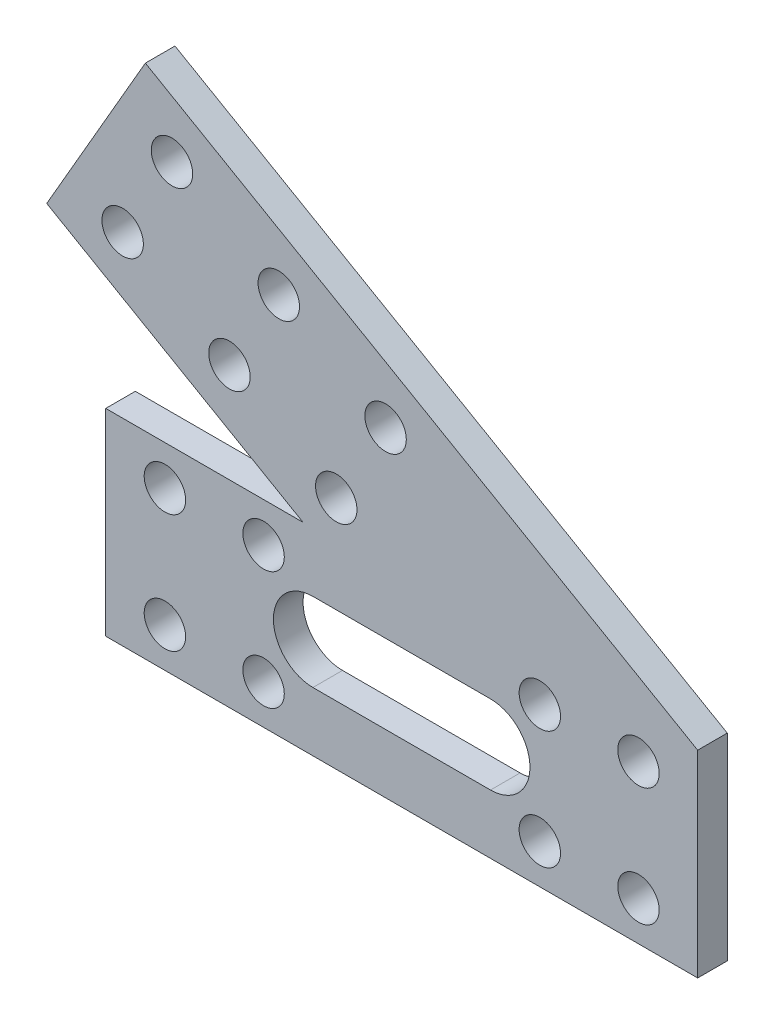
ISO-10303-21;
HEADER;
FILE_DESCRIPTION(('STEP AP214'),'2;1');
FILE_NAME('part.step','',(''),(''),'','','');
FILE_SCHEMA(('AUTOMOTIVE_DESIGN { 1 0 10303 214 1 1 1 1 }'));
ENDSEC;
DATA;
#1=APPLICATION_CONTEXT('core data for automotive mechanical design processes');
#2=APPLICATION_PROTOCOL_DEFINITION('international standard','automotive_design',2000,#1);
#3=PRODUCT_CONTEXT('',#1,'mechanical');
#4=PRODUCT('Part','Part','',(#3));
#5=PRODUCT_RELATED_PRODUCT_CATEGORY('part','',(#4));
#6=PRODUCT_DEFINITION_FORMATION('','',#4);
#7=PRODUCT_DEFINITION_CONTEXT('part definition',#1,'design');
#8=PRODUCT_DEFINITION('design','',#6,#7);
#9=PRODUCT_DEFINITION_SHAPE('','',#8);
#10=(LENGTH_UNIT() NAMED_UNIT(*) SI_UNIT(.MILLI.,.METRE.));
#11=(NAMED_UNIT(*) PLANE_ANGLE_UNIT() SI_UNIT($,.RADIAN.));
#12=(NAMED_UNIT(*) SI_UNIT($,.STERADIAN.) SOLID_ANGLE_UNIT());
#13=UNCERTAINTY_MEASURE_WITH_UNIT(LENGTH_MEASURE(1.E-05),#10,'distance_accuracy_value','');
#14=(GEOMETRIC_REPRESENTATION_CONTEXT(3) GLOBAL_UNCERTAINTY_ASSIGNED_CONTEXT((#13)) GLOBAL_UNIT_ASSIGNED_CONTEXT((#10,
#11,#12)) REPRESENTATION_CONTEXT('',''));
#15=CARTESIAN_POINT('',(0.,0.,0.));
#16=DIRECTION('',(0.,0.,1.));
#17=DIRECTION('',(1.,0.,0.));
#18=AXIS2_PLACEMENT_3D('',#15,#16,#17);
#19=CARTESIAN_POINT('',(60.,20.,3.));
#20=DIRECTION('',(-1.,0.,0.));
#21=DIRECTION('',(0.,0.,1.));
#22=AXIS2_PLACEMENT_3D('',#19,#20,#21);
#23=PLANE('',#22);
#24=DIRECTION('',(0.,1.,0.));
#25=VECTOR('',#24,1.);
#26=CARTESIAN_POINT('',(60.,20.,0.));
#27=LINE('',#26,#25);
#28=CARTESIAN_POINT('',(60.,0.,0.));
#29=VERTEX_POINT('',#28);
#30=CARTESIAN_POINT('',(60.,20.,0.));
#31=VERTEX_POINT('',#30);
#32=EDGE_CURVE('E203',#29,#31,#27,.T.);
#33=ORIENTED_EDGE('',*,*,#32,.T.);
#34=DIRECTION('',(0.,0.,-1.));
#35=VECTOR('',#34,1.);
#36=CARTESIAN_POINT('',(60.,20.,3.));
#37=LINE('',#36,#35);
#38=CARTESIAN_POINT('',(60.,20.,3.));
#39=VERTEX_POINT('',#38);
#40=EDGE_CURVE('E234',#39,#31,#37,.T.);
#41=ORIENTED_EDGE('',*,*,#40,.F.);
#42=DIRECTION('',(0.,1.,0.));
#43=VECTOR('',#42,1.);
#44=CARTESIAN_POINT('',(60.,20.,3.));
#45=LINE('',#44,#43);
#46=CARTESIAN_POINT('',(60.,0.,3.));
#47=VERTEX_POINT('',#46);
#48=EDGE_CURVE('E186',#47,#39,#45,.T.);
#49=ORIENTED_EDGE('',*,*,#48,.F.);
#50=DIRECTION('',(0.,0.,-1.));
#51=VECTOR('',#50,1.);
#52=CARTESIAN_POINT('',(60.,0.,3.));
#53=LINE('',#52,#51);
#54=EDGE_CURVE('E202',#47,#29,#53,.T.);
#55=ORIENTED_EDGE('',*,*,#54,.T.);
#56=EDGE_LOOP('',(#33,#41,#49,#55));
#57=FACE_BOUND('',#56,.T.);
#58=ADVANCED_FACE('F35',(#57),#23,.F.);
#59=CARTESIAN_POINT('',(4.01923788646753,52.3205080756886,3.));
#60=DIRECTION('',(-0.500000000000002,-0.866025403784437,0.));
#61=DIRECTION('',(0.866025403784437,-0.500000000000002,0.));
#62=AXIS2_PLACEMENT_3D('',#59,#60,#61);
#63=PLANE('',#62);
#64=DIRECTION('',(-0.866025403784437,0.500000000000002,0.));
#65=VECTOR('',#64,1.);
#66=CARTESIAN_POINT('',(4.01923788646753,52.3205080756886,0.));
#67=LINE('',#66,#65);
#68=CARTESIAN_POINT('',(4.01923788646753,52.3205080756886,0.));
#69=VERTEX_POINT('',#68);
#70=EDGE_CURVE('E206',#31,#69,#67,.T.);
#71=ORIENTED_EDGE('',*,*,#70,.T.);
#72=DIRECTION('',(0.,0.,-1.));
#73=VECTOR('',#72,1.);
#74=CARTESIAN_POINT('',(4.01923788646753,52.3205080756886,3.));
#75=LINE('',#74,#73);
#76=CARTESIAN_POINT('',(4.01923788646753,52.3205080756886,3.));
#77=VERTEX_POINT('',#76);
#78=EDGE_CURVE('E231',#77,#69,#75,.T.);
#79=ORIENTED_EDGE('',*,*,#78,.F.);
#80=DIRECTION('',(-0.866025403784437,0.500000000000002,0.));
#81=VECTOR('',#80,1.);
#82=CARTESIAN_POINT('',(4.01923788646753,52.3205080756886,3.));
#83=LINE('',#82,#81);
#84=EDGE_CURVE('E189',#39,#77,#83,.T.);
#85=ORIENTED_EDGE('',*,*,#84,.F.);
#86=ORIENTED_EDGE('',*,*,#40,.T.);
#87=EDGE_LOOP('',(#71,#79,#85,#86));
#88=FACE_BOUND('',#87,.T.);
#89=ADVANCED_FACE('F350',(#88),#63,.F.);
#90=CARTESIAN_POINT('',(-5.98076211353237,34.9999999999998,3.));
#91=DIRECTION('',(0.866025403784441,-0.499999999999995,0.));
#92=DIRECTION('',(0.499999999999995,0.866025403784441,0.));
#93=AXIS2_PLACEMENT_3D('',#90,#91,#92);
#94=PLANE('',#93);
#95=DIRECTION('',(-0.499999999999995,-0.866025403784441,0.));
#96=VECTOR('',#95,1.);
#97=CARTESIAN_POINT('',(-5.98076211353237,34.9999999999998,0.));
#98=LINE('',#97,#96);
#99=CARTESIAN_POINT('',(-5.98076211353237,34.9999999999998,0.));
#100=VERTEX_POINT('',#99);
#101=EDGE_CURVE('E208',#69,#100,#98,.T.);
#102=ORIENTED_EDGE('',*,*,#101,.T.);
#103=DIRECTION('',(0.,0.,-1.));
#104=VECTOR('',#103,1.);
#105=CARTESIAN_POINT('',(-5.98076211353237,34.9999999999998,3.));
#106=LINE('',#105,#104);
#107=CARTESIAN_POINT('',(-5.98076211353237,34.9999999999998,3.));
#108=VERTEX_POINT('',#107);
#109=EDGE_CURVE('E228',#108,#100,#106,.T.);
#110=ORIENTED_EDGE('',*,*,#109,.F.);
#111=DIRECTION('',(-0.499999999999995,-0.866025403784441,0.));
#112=VECTOR('',#111,1.);
#113=CARTESIAN_POINT('',(-5.98076211353237,34.9999999999998,3.));
#114=LINE('',#113,#112);
#115=EDGE_CURVE('E192',#77,#108,#114,.T.);
#116=ORIENTED_EDGE('',*,*,#115,.F.);
#117=ORIENTED_EDGE('',*,*,#78,.T.);
#118=EDGE_LOOP('',(#102,#110,#116,#117));
#119=FACE_BOUND('',#118,.T.);
#120=ADVANCED_FACE('F347',(#119),#94,.F.);
#121=CARTESIAN_POINT('',(20.0000000000009,19.9999999999999,3.));
#122=DIRECTION('',(0.499999999999995,0.866025403784442,0.));
#123=DIRECTION('',(-0.866025403784442,0.499999999999995,0.));
#124=AXIS2_PLACEMENT_3D('',#121,#122,#123);
#125=PLANE('',#124);
#126=DIRECTION('',(0.866025403784441,-0.499999999999995,0.));
#127=VECTOR('',#126,1.);
#128=CARTESIAN_POINT('',(20.0000000000009,19.9999999999999,0.));
#129=LINE('',#128,#127);
#130=CARTESIAN_POINT('',(20.0000000000009,19.9999999999999,0.));
#131=VERTEX_POINT('',#130);
#132=EDGE_CURVE('E210',#100,#131,#129,.T.);
#133=ORIENTED_EDGE('',*,*,#132,.T.);
#134=DIRECTION('',(0.,0.,-1.));
#135=VECTOR('',#134,1.);
#136=CARTESIAN_POINT('',(20.0000000000009,19.9999999999999,3.));
#137=LINE('',#136,#135);
#138=CARTESIAN_POINT('',(20.0000000000009,19.9999999999999,3.));
#139=VERTEX_POINT('',#138);
#140=EDGE_CURVE('E225',#139,#131,#137,.T.);
#141=ORIENTED_EDGE('',*,*,#140,.F.);
#142=DIRECTION('',(0.866025403784441,-0.499999999999995,0.));
#143=VECTOR('',#142,1.);
#144=CARTESIAN_POINT('',(20.0000000000009,19.9999999999999,3.));
#145=LINE('',#144,#143);
#146=EDGE_CURVE('E194',#108,#139,#145,.T.);
#147=ORIENTED_EDGE('',*,*,#146,.F.);
#148=ORIENTED_EDGE('',*,*,#109,.T.);
#149=EDGE_LOOP('',(#133,#141,#147,#148));
#150=FACE_BOUND('',#149,.T.);
#151=ADVANCED_FACE('F343',(#150),#125,.F.);
#152=CARTESIAN_POINT('',(20.0000000000009,19.9999999999999,3.));
#153=DIRECTION('',(0.,-1.,0.));
#154=DIRECTION('',(1.,0.,0.));
#155=AXIS2_PLACEMENT_3D('',#152,#153,#154);
#156=PLANE('',#155);
#157=DIRECTION('',(-1.,0.,0.));
#158=VECTOR('',#157,1.);
#159=CARTESIAN_POINT('',(20.0000000000009,19.9999999999999,0.));
#160=LINE('',#159,#158);
#161=CARTESIAN_POINT('',(0.,20.,0.));
#162=VERTEX_POINT('',#161);
#163=EDGE_CURVE('E212',#131,#162,#160,.T.);
#164=ORIENTED_EDGE('',*,*,#163,.T.);
#165=DIRECTION('',(0.,0.,-1.));
#166=VECTOR('',#165,1.);
#167=CARTESIAN_POINT('',(0.,20.,3.));
#168=LINE('',#167,#166);
#169=CARTESIAN_POINT('',(0.,20.,3.));
#170=VERTEX_POINT('',#169);
#171=EDGE_CURVE('E222',#170,#162,#168,.T.);
#172=ORIENTED_EDGE('',*,*,#171,.F.);
#173=DIRECTION('',(-1.,0.,0.));
#174=VECTOR('',#173,1.);
#175=CARTESIAN_POINT('',(20.0000000000009,19.9999999999999,3.));
#176=LINE('',#175,#174);
#177=EDGE_CURVE('E196',#139,#170,#176,.T.);
#178=ORIENTED_EDGE('',*,*,#177,.F.);
#179=ORIENTED_EDGE('',*,*,#140,.T.);
#180=EDGE_LOOP('',(#164,#172,#178,#179));
#181=FACE_BOUND('',#180,.T.);
#182=ADVANCED_FACE('F338',(#181),#156,.F.);
#183=CARTESIAN_POINT('',(0.,0.,3.));
#184=DIRECTION('',(1.,0.,0.));
#185=DIRECTION('',(0.,0.,-1.));
#186=AXIS2_PLACEMENT_3D('',#183,#184,#185);
#187=PLANE('',#186);
#188=DIRECTION('',(0.,-1.,0.));
#189=VECTOR('',#188,1.);
#190=CARTESIAN_POINT('',(0.,0.,0.));
#191=LINE('',#190,#189);
#192=CARTESIAN_POINT('',(0.,0.,0.));
#193=VERTEX_POINT('',#192);
#194=EDGE_CURVE('E214',#162,#193,#191,.T.);
#195=ORIENTED_EDGE('',*,*,#194,.T.);
#196=DIRECTION('',(0.,0.,-1.));
#197=VECTOR('',#196,1.);
#198=CARTESIAN_POINT('',(0.,0.,3.));
#199=LINE('',#198,#197);
#200=CARTESIAN_POINT('',(0.,0.,3.));
#201=VERTEX_POINT('',#200);
#202=EDGE_CURVE('E219',#201,#193,#199,.T.);
#203=ORIENTED_EDGE('',*,*,#202,.F.);
#204=DIRECTION('',(0.,-1.,0.));
#205=VECTOR('',#204,1.);
#206=CARTESIAN_POINT('',(0.,0.,3.));
#207=LINE('',#206,#205);
#208=EDGE_CURVE('E198',#170,#201,#207,.T.);
#209=ORIENTED_EDGE('',*,*,#208,.F.);
#210=ORIENTED_EDGE('',*,*,#171,.T.);
#211=EDGE_LOOP('',(#195,#203,#209,#210));
#212=FACE_BOUND('',#211,.T.);
#213=ADVANCED_FACE('F333',(#212),#187,.F.);
#214=CARTESIAN_POINT('',(60.,0.,3.));
#215=DIRECTION('',(0.,1.,0.));
#216=DIRECTION('',(-1.,0.,0.));
#217=AXIS2_PLACEMENT_3D('',#214,#215,#216);
#218=PLANE('',#217);
#219=DIRECTION('',(1.,0.,0.));
#220=VECTOR('',#219,1.);
#221=CARTESIAN_POINT('',(60.,0.,0.));
#222=LINE('',#221,#220);
#223=EDGE_CURVE('E190',#193,#29,#222,.T.);
#224=ORIENTED_EDGE('',*,*,#223,.T.);
#225=ORIENTED_EDGE('',*,*,#54,.F.);
#226=DIRECTION('',(1.,0.,0.));
#227=VECTOR('',#226,1.);
#228=CARTESIAN_POINT('',(60.,0.,3.));
#229=LINE('',#228,#227);
#230=EDGE_CURVE('E200',#201,#47,#229,.T.);
#231=ORIENTED_EDGE('',*,*,#230,.F.);
#232=ORIENTED_EDGE('',*,*,#202,.T.);
#233=EDGE_LOOP('',(#224,#225,#231,#232));
#234=FACE_BOUND('',#233,.T.);
#235=ADVANCED_FACE('F329',(#234),#218,.F.);
#236=CARTESIAN_POINT('',(0.,0.,3.));
#237=DIRECTION('',(0.,0.,-1.));
#238=DIRECTION('',(-1.,0.,0.));
#239=AXIS2_PLACEMENT_3D('',#236,#237,#238);
#240=PLANE('',#239);
#241=CARTESIAN_POINT('',(6.71539030917408,44.9903810567662,3.));
#242=DIRECTION('',(0.,0.,1.));
#243=DIRECTION('',(1.,0.,0.));
#244=AXIS2_PLACEMENT_3D('',#241,#242,#243);
#245=CIRCLE('',#244,2.1);
#246=CARTESIAN_POINT('',(8.81539030917407,44.9903810567662,3.));
#247=VERTEX_POINT('',#246);
#248=EDGE_CURVE('E177',#247,#247,#245,.T.);
#249=ORIENTED_EDGE('',*,*,#248,.F.);
#250=EDGE_LOOP('',(#249));
#251=FACE_BOUND('',#250,.T.);
#252=CARTESIAN_POINT('',(44.,15.9999999999999,3.));
#253=DIRECTION('',(0.,0.,1.));
#254=DIRECTION('',(1.,0.,0.));
#255=AXIS2_PLACEMENT_3D('',#252,#253,#254);
#256=CIRCLE('',#255,2.1);
#257=CARTESIAN_POINT('',(46.1,15.9999999999999,3.));
#258=VERTEX_POINT('',#257);
#259=EDGE_CURVE('E149',#258,#258,#256,.T.);
#260=ORIENTED_EDGE('',*,*,#259,.F.);
#261=EDGE_LOOP('',(#260));
#262=FACE_BOUND('',#261,.T.);
#263=CARTESIAN_POINT('',(16.,3.99999999999991,3.));
#264=DIRECTION('',(0.,0.,1.));
#265=DIRECTION('',(1.,0.,0.));
#266=AXIS2_PLACEMENT_3D('',#263,#264,#265);
#267=CIRCLE('',#266,2.1);
#268=CARTESIAN_POINT('',(18.1,3.99999999999991,3.));
#269=VERTEX_POINT('',#268);
#270=EDGE_CURVE('E150',#269,#269,#267,.T.);
#271=ORIENTED_EDGE('',*,*,#270,.F.);
#272=EDGE_LOOP('',(#271));
#273=FACE_BOUND('',#272,.T.);
#274=CARTESIAN_POINT('',(16.,15.9999999999999,3.));
#275=DIRECTION('',(0.,0.,1.));
#276=DIRECTION('',(1.,0.,0.));
#277=AXIS2_PLACEMENT_3D('',#274,#275,#276);
#278=CIRCLE('',#277,2.1);
#279=CARTESIAN_POINT('',(18.1,15.9999999999999,3.));
#280=VERTEX_POINT('',#279);
#281=EDGE_CURVE('E153',#280,#280,#278,.T.);
#282=ORIENTED_EDGE('',*,*,#281,.F.);
#283=EDGE_LOOP('',(#282));
#284=FACE_BOUND('',#283,.T.);
#285=CARTESIAN_POINT('',(54.,3.99999999999991,3.));
#286=DIRECTION('',(0.,0.,1.));
#287=DIRECTION('',(1.,0.,0.));
#288=AXIS2_PLACEMENT_3D('',#285,#286,#287);
#289=CIRCLE('',#288,2.1);
#290=CARTESIAN_POINT('',(56.1,3.99999999999991,3.));
#291=VERTEX_POINT('',#290);
#292=EDGE_CURVE('E156',#291,#291,#289,.T.);
#293=ORIENTED_EDGE('',*,*,#292,.F.);
#294=EDGE_LOOP('',(#293));
#295=FACE_BOUND('',#294,.T.);
#296=DIRECTION('',(1.,0.,0.));
#297=VECTOR('',#296,1.);
#298=CARTESIAN_POINT('',(21.,5.99999999999991,3.));
#299=LINE('',#298,#297);
#300=CARTESIAN_POINT('',(21.,5.99999999999991,3.));
#301=VERTEX_POINT('',#300);
#302=CARTESIAN_POINT('',(39.,5.99999999999991,3.));
#303=VERTEX_POINT('',#302);
#304=EDGE_CURVE('E130',#301,#303,#299,.T.);
#305=ORIENTED_EDGE('',*,*,#304,.F.);
#306=CARTESIAN_POINT('',(21.,9.99999999999991,3.));
#307=DIRECTION('',(0.,0.,1.));
#308=DIRECTION('',(1.,0.,0.));
#309=AXIS2_PLACEMENT_3D('',#306,#307,#308);
#310=CIRCLE('',#309,4.);
#311=CARTESIAN_POINT('',(21.,13.9999999999999,3.));
#312=VERTEX_POINT('',#311);
#313=EDGE_CURVE('E51',#312,#301,#310,.T.);
#314=ORIENTED_EDGE('',*,*,#313,.F.);
#315=DIRECTION('',(-1.,0.,0.));
#316=VECTOR('',#315,1.);
#317=CARTESIAN_POINT('',(21.,13.9999999999999,3.));
#318=LINE('',#317,#316);
#319=CARTESIAN_POINT('',(39.,13.9999999999999,3.));
#320=VERTEX_POINT('',#319);
#321=EDGE_CURVE('E137',#320,#312,#318,.T.);
#322=ORIENTED_EDGE('',*,*,#321,.F.);
#323=CARTESIAN_POINT('',(39.,9.99999999999991,3.));
#324=DIRECTION('',(0.,0.,1.));
#325=DIRECTION('',(1.,0.,0.));
#326=AXIS2_PLACEMENT_3D('',#323,#324,#325);
#327=CIRCLE('',#326,4.);
#328=EDGE_CURVE('E121',#303,#320,#327,.T.);
#329=ORIENTED_EDGE('',*,*,#328,.F.);
#330=EDGE_LOOP('',(#305,#314,#322,#329));
#331=FACE_BOUND('',#330,.T.);
#332=CARTESIAN_POINT('',(44.,3.99999999999991,3.));
#333=DIRECTION('',(0.,0.,1.));
#334=DIRECTION('',(1.,0.,0.));
#335=AXIS2_PLACEMENT_3D('',#332,#333,#334);
#336=CIRCLE('',#335,2.1);
#337=CARTESIAN_POINT('',(46.1,3.99999999999991,3.));
#338=VERTEX_POINT('',#337);
#339=EDGE_CURVE('E144',#338,#338,#336,.T.);
#340=ORIENTED_EDGE('',*,*,#339,.F.);
#341=EDGE_LOOP('',(#340));
#342=FACE_BOUND('',#341,.T.);
#343=CARTESIAN_POINT('',(1.71539030917408,36.3301270189219,3.));
#344=DIRECTION('',(0.,0.,1.));
#345=DIRECTION('',(1.,0.,0.));
#346=AXIS2_PLACEMENT_3D('',#343,#344,#345);
#347=CIRCLE('',#346,2.1);
#348=CARTESIAN_POINT('',(3.81539030917407,36.3301270189219,3.));
#349=VERTEX_POINT('',#348);
#350=EDGE_CURVE('E174',#349,#349,#347,.T.);
#351=ORIENTED_EDGE('',*,*,#350,.F.);
#352=EDGE_LOOP('',(#351));
#353=FACE_BOUND('',#352,.T.);
#354=CARTESIAN_POINT('',(17.5407078564796,38.7403810567662,3.));
#355=DIRECTION('',(0.,0.,1.));
#356=DIRECTION('',(1.,0.,0.));
#357=AXIS2_PLACEMENT_3D('',#354,#355,#356);
#358=CIRCLE('',#357,2.1);
#359=CARTESIAN_POINT('',(19.6407078564796,38.7403810567662,3.));
#360=VERTEX_POINT('',#359);
#361=EDGE_CURVE('E178',#360,#360,#358,.T.);
#362=ORIENTED_EDGE('',*,*,#361,.F.);
#363=EDGE_LOOP('',(#362));
#364=FACE_BOUND('',#363,.T.);
#365=CARTESIAN_POINT('',(12.5407078564796,30.0801270189219,3.));
#366=DIRECTION('',(0.,0.,1.));
#367=DIRECTION('',(1.,0.,0.));
#368=AXIS2_PLACEMENT_3D('',#365,#366,#367);
#369=CIRCLE('',#368,2.09999999999999);
#370=CARTESIAN_POINT('',(14.6407078564796,30.0801270189219,3.));
#371=VERTEX_POINT('',#370);
#372=EDGE_CURVE('E181',#371,#371,#369,.T.);
#373=ORIENTED_EDGE('',*,*,#372,.F.);
#374=EDGE_LOOP('',(#373));
#375=FACE_BOUND('',#374,.T.);
#376=CARTESIAN_POINT('',(23.366025403785,23.8301270189219,3.));
#377=DIRECTION('',(0.,0.,1.));
#378=DIRECTION('',(1.,0.,0.));
#379=AXIS2_PLACEMENT_3D('',#376,#377,#378);
#380=CIRCLE('',#379,2.1);
#381=CARTESIAN_POINT('',(25.466025403785,23.8301270189219,3.));
#382=VERTEX_POINT('',#381);
#383=EDGE_CURVE('E171',#382,#382,#380,.T.);
#384=ORIENTED_EDGE('',*,*,#383,.F.);
#385=EDGE_LOOP('',(#384));
#386=FACE_BOUND('',#385,.T.);
#387=CARTESIAN_POINT('',(54.,15.9999999999999,3.));
#388=DIRECTION('',(0.,0.,1.));
#389=DIRECTION('',(1.,0.,0.));
#390=AXIS2_PLACEMENT_3D('',#387,#388,#389);
#391=CIRCLE('',#390,2.1);
#392=CARTESIAN_POINT('',(56.1,15.9999999999999,3.));
#393=VERTEX_POINT('',#392);
#394=EDGE_CURVE('E159',#393,#393,#391,.T.);
#395=ORIENTED_EDGE('',*,*,#394,.F.);
#396=EDGE_LOOP('',(#395));
#397=FACE_BOUND('',#396,.T.);
#398=CARTESIAN_POINT('',(6.,3.99999999999991,3.));
#399=DIRECTION('',(0.,0.,1.));
#400=DIRECTION('',(1.,0.,0.));
#401=AXIS2_PLACEMENT_3D('',#398,#399,#400);
#402=CIRCLE('',#401,2.1);
#403=CARTESIAN_POINT('',(8.1,3.99999999999991,3.));
#404=VERTEX_POINT('',#403);
#405=EDGE_CURVE('E162',#404,#404,#402,.T.);
#406=ORIENTED_EDGE('',*,*,#405,.F.);
#407=EDGE_LOOP('',(#406));
#408=FACE_BOUND('',#407,.T.);
#409=CARTESIAN_POINT('',(6.,15.9999999999999,3.));
#410=DIRECTION('',(0.,0.,1.));
#411=DIRECTION('',(1.,0.,0.));
#412=AXIS2_PLACEMENT_3D('',#409,#410,#411);
#413=CIRCLE('',#412,2.1);
#414=CARTESIAN_POINT('',(8.1,15.9999999999999,3.));
#415=VERTEX_POINT('',#414);
#416=EDGE_CURVE('E165',#415,#415,#413,.T.);
#417=ORIENTED_EDGE('',*,*,#416,.F.);
#418=EDGE_LOOP('',(#417));
#419=FACE_BOUND('',#418,.T.);
#420=CARTESIAN_POINT('',(28.366025403785,32.4903810567663,3.));
#421=DIRECTION('',(0.,0.,1.));
#422=DIRECTION('',(1.,0.,0.));
#423=AXIS2_PLACEMENT_3D('',#420,#421,#422);
#424=CIRCLE('',#423,2.1);
#425=CARTESIAN_POINT('',(30.466025403785,32.4903810567663,3.));
#426=VERTEX_POINT('',#425);
#427=EDGE_CURVE('E168',#426,#426,#424,.T.);
#428=ORIENTED_EDGE('',*,*,#427,.F.);
#429=EDGE_LOOP('',(#428));
#430=FACE_BOUND('',#429,.T.);
#431=ORIENTED_EDGE('',*,*,#48,.T.);
#432=ORIENTED_EDGE('',*,*,#84,.T.);
#433=ORIENTED_EDGE('',*,*,#115,.T.);
#434=ORIENTED_EDGE('',*,*,#146,.T.);
#435=ORIENTED_EDGE('',*,*,#177,.T.);
#436=ORIENTED_EDGE('',*,*,#208,.T.);
#437=ORIENTED_EDGE('',*,*,#230,.T.);
#438=EDGE_LOOP('',(#431,#432,#433,#434,#435,#436,#437));
#439=FACE_BOUND('',#438,.T.);
#440=ADVANCED_FACE('F134',(#251,#262,#273,#284,#295,#331,#342,#353,#364,#375,#386,#397,#408,
#419,#430,#439),#240,.F.);
#441=CARTESIAN_POINT('',(0.,0.,0.));
#442=DIRECTION('',(0.,0.,-1.));
#443=DIRECTION('',(-1.,0.,0.));
#444=AXIS2_PLACEMENT_3D('',#441,#442,#443);
#445=PLANE('',#444);
#446=CARTESIAN_POINT('',(6.71539030917408,44.9903810567662,0.));
#447=DIRECTION('',(0.,0.,-1.));
#448=DIRECTION('',(-1.,0.,0.));
#449=AXIS2_PLACEMENT_3D('',#446,#447,#448);
#450=CIRCLE('',#449,2.1);
#451=CARTESIAN_POINT('',(4.61539030917408,44.9903810567662,0.));
#452=VERTEX_POINT('',#451);
#453=EDGE_CURVE('E38',#452,#452,#450,.T.);
#454=ORIENTED_EDGE('',*,*,#453,.F.);
#455=EDGE_LOOP('',(#454));
#456=FACE_BOUND('',#455,.T.);
#457=CARTESIAN_POINT('',(44.,15.9999999999999,0.));
#458=DIRECTION('',(0.,0.,-1.));
#459=DIRECTION('',(-1.,0.,0.));
#460=AXIS2_PLACEMENT_3D('',#457,#458,#459);
#461=CIRCLE('',#460,2.1);
#462=CARTESIAN_POINT('',(41.9,15.9999999999999,0.));
#463=VERTEX_POINT('',#462);
#464=EDGE_CURVE('E276',#463,#463,#461,.T.);
#465=ORIENTED_EDGE('',*,*,#464,.F.);
#466=EDGE_LOOP('',(#465));
#467=FACE_BOUND('',#466,.T.);
#468=CARTESIAN_POINT('',(16.,3.99999999999991,0.));
#469=DIRECTION('',(0.,0.,-1.));
#470=DIRECTION('',(-1.,0.,0.));
#471=AXIS2_PLACEMENT_3D('',#468,#469,#470);
#472=CIRCLE('',#471,2.1);
#473=CARTESIAN_POINT('',(13.9,3.99999999999991,0.));
#474=VERTEX_POINT('',#473);
#475=EDGE_CURVE('E274',#474,#474,#472,.T.);
#476=ORIENTED_EDGE('',*,*,#475,.F.);
#477=EDGE_LOOP('',(#476));
#478=FACE_BOUND('',#477,.T.);
#479=CARTESIAN_POINT('',(16.,15.9999999999999,0.));
#480=DIRECTION('',(0.,0.,-1.));
#481=DIRECTION('',(-1.,0.,0.));
#482=AXIS2_PLACEMENT_3D('',#479,#480,#481);
#483=CIRCLE('',#482,2.1);
#484=CARTESIAN_POINT('',(13.9,15.9999999999999,0.));
#485=VERTEX_POINT('',#484);
#486=EDGE_CURVE('E271',#485,#485,#483,.T.);
#487=ORIENTED_EDGE('',*,*,#486,.F.);
#488=EDGE_LOOP('',(#487));
#489=FACE_BOUND('',#488,.T.);
#490=CARTESIAN_POINT('',(54.,3.99999999999991,0.));
#491=DIRECTION('',(0.,0.,-1.));
#492=DIRECTION('',(-1.,0.,0.));
#493=AXIS2_PLACEMENT_3D('',#490,#491,#492);
#494=CIRCLE('',#493,2.1);
#495=CARTESIAN_POINT('',(51.9,3.99999999999991,0.));
#496=VERTEX_POINT('',#495);
#497=EDGE_CURVE('E265',#496,#496,#494,.T.);
#498=ORIENTED_EDGE('',*,*,#497,.F.);
#499=EDGE_LOOP('',(#498));
#500=FACE_BOUND('',#499,.T.);
#501=CARTESIAN_POINT('',(21.,9.99999999999991,0.));
#502=DIRECTION('',(0.,0.,-1.));
#503=DIRECTION('',(-1.,0.,0.));
#504=AXIS2_PLACEMENT_3D('',#501,#502,#503);
#505=CIRCLE('',#504,4.);
#506=CARTESIAN_POINT('',(21.,5.99999999999991,0.));
#507=VERTEX_POINT('',#506);
#508=CARTESIAN_POINT('',(21.,13.9999999999999,0.));
#509=VERTEX_POINT('',#508);
#510=EDGE_CURVE('E11',#507,#509,#505,.T.);
#511=ORIENTED_EDGE('',*,*,#510,.F.);
#512=DIRECTION('',(-1.,0.,0.));
#513=VECTOR('',#512,1.);
#514=CARTESIAN_POINT('',(0.,5.9999999999999,0.));
#515=LINE('',#514,#513);
#516=CARTESIAN_POINT('',(39.,5.99999999999991,0.));
#517=VERTEX_POINT('',#516);
#518=EDGE_CURVE('E237',#517,#507,#515,.T.);
#519=ORIENTED_EDGE('',*,*,#518,.F.);
#520=CARTESIAN_POINT('',(39.,9.99999999999991,0.));
#521=DIRECTION('',(0.,0.,-1.));
#522=DIRECTION('',(-1.,0.,0.));
#523=AXIS2_PLACEMENT_3D('',#520,#521,#522);
#524=CIRCLE('',#523,4.);
#525=CARTESIAN_POINT('',(39.,13.9999999999999,0.));
#526=VERTEX_POINT('',#525);
#527=EDGE_CURVE('E124',#526,#517,#524,.T.);
#528=ORIENTED_EDGE('',*,*,#527,.F.);
#529=DIRECTION('',(1.,0.,0.));
#530=VECTOR('',#529,1.);
#531=CARTESIAN_POINT('',(0.,13.9999999999999,0.));
#532=LINE('',#531,#530);
#533=EDGE_CURVE('E43',#509,#526,#532,.T.);
#534=ORIENTED_EDGE('',*,*,#533,.F.);
#535=EDGE_LOOP('',(#511,#519,#528,#534));
#536=FACE_BOUND('',#535,.T.);
#537=CARTESIAN_POINT('',(44.,3.99999999999991,0.));
#538=DIRECTION('',(0.,0.,-1.));
#539=DIRECTION('',(-1.,0.,0.));
#540=AXIS2_PLACEMENT_3D('',#537,#538,#539);
#541=CIRCLE('',#540,2.1);
#542=CARTESIAN_POINT('',(41.9,3.99999999999991,0.));
#543=VERTEX_POINT('',#542);
#544=EDGE_CURVE('E262',#543,#543,#541,.T.);
#545=ORIENTED_EDGE('',*,*,#544,.F.);
#546=EDGE_LOOP('',(#545));
#547=FACE_BOUND('',#546,.T.);
#548=CARTESIAN_POINT('',(1.71539030917408,36.3301270189219,0.));
#549=DIRECTION('',(0.,0.,-1.));
#550=DIRECTION('',(-1.,0.,0.));
#551=AXIS2_PLACEMENT_3D('',#548,#549,#550);
#552=CIRCLE('',#551,2.1);
#553=CARTESIAN_POINT('',(-0.384609690825922,36.3301270189219,0.));
#554=VERTEX_POINT('',#553);
#555=EDGE_CURVE('E259',#554,#554,#552,.T.);
#556=ORIENTED_EDGE('',*,*,#555,.F.);
#557=EDGE_LOOP('',(#556));
#558=FACE_BOUND('',#557,.T.);
#559=CARTESIAN_POINT('',(17.5407078564796,38.7403810567662,0.));
#560=DIRECTION('',(0.,0.,-1.));
#561=DIRECTION('',(-1.,0.,0.));
#562=AXIS2_PLACEMENT_3D('',#559,#560,#561);
#563=CIRCLE('',#562,2.1);
#564=CARTESIAN_POINT('',(15.4407078564796,38.7403810567662,0.));
#565=VERTEX_POINT('',#564);
#566=EDGE_CURVE('E256',#565,#565,#563,.T.);
#567=ORIENTED_EDGE('',*,*,#566,.F.);
#568=EDGE_LOOP('',(#567));
#569=FACE_BOUND('',#568,.T.);
#570=CARTESIAN_POINT('',(12.5407078564796,30.0801270189219,0.));
#571=DIRECTION('',(0.,0.,-1.));
#572=DIRECTION('',(-1.,0.,0.));
#573=AXIS2_PLACEMENT_3D('',#570,#571,#572);
#574=CIRCLE('',#573,2.09999999999999);
#575=CARTESIAN_POINT('',(10.4407078564796,30.0801270189219,0.));
#576=VERTEX_POINT('',#575);
#577=EDGE_CURVE('E253',#576,#576,#574,.T.);
#578=ORIENTED_EDGE('',*,*,#577,.F.);
#579=EDGE_LOOP('',(#578));
#580=FACE_BOUND('',#579,.T.);
#581=CARTESIAN_POINT('',(23.366025403785,23.8301270189219,0.));
#582=DIRECTION('',(0.,0.,-1.));
#583=DIRECTION('',(-1.,0.,0.));
#584=AXIS2_PLACEMENT_3D('',#581,#582,#583);
#585=CIRCLE('',#584,2.1);
#586=CARTESIAN_POINT('',(21.2660254037851,23.8301270189219,0.));
#587=VERTEX_POINT('',#586);
#588=EDGE_CURVE('E250',#587,#587,#585,.T.);
#589=ORIENTED_EDGE('',*,*,#588,.F.);
#590=EDGE_LOOP('',(#589));
#591=FACE_BOUND('',#590,.T.);
#592=CARTESIAN_POINT('',(54.,15.9999999999999,0.));
#593=DIRECTION('',(0.,0.,-1.));
#594=DIRECTION('',(-1.,0.,0.));
#595=AXIS2_PLACEMENT_3D('',#592,#593,#594);
#596=CIRCLE('',#595,2.1);
#597=CARTESIAN_POINT('',(51.9,15.9999999999999,0.));
#598=VERTEX_POINT('',#597);
#599=EDGE_CURVE('E247',#598,#598,#596,.T.);
#600=ORIENTED_EDGE('',*,*,#599,.F.);
#601=EDGE_LOOP('',(#600));
#602=FACE_BOUND('',#601,.T.);
#603=CARTESIAN_POINT('',(6.,3.99999999999991,0.));
#604=DIRECTION('',(0.,0.,-1.));
#605=DIRECTION('',(-1.,0.,0.));
#606=AXIS2_PLACEMENT_3D('',#603,#604,#605);
#607=CIRCLE('',#606,2.1);
#608=CARTESIAN_POINT('',(3.9,3.99999999999991,0.));
#609=VERTEX_POINT('',#608);
#610=EDGE_CURVE('E244',#609,#609,#607,.T.);
#611=ORIENTED_EDGE('',*,*,#610,.F.);
#612=EDGE_LOOP('',(#611));
#613=FACE_BOUND('',#612,.T.);
#614=CARTESIAN_POINT('',(6.,15.9999999999999,0.));
#615=DIRECTION('',(0.,0.,-1.));
#616=DIRECTION('',(-1.,0.,0.));
#617=AXIS2_PLACEMENT_3D('',#614,#615,#616);
#618=CIRCLE('',#617,2.1);
#619=CARTESIAN_POINT('',(3.90000000000001,15.9999999999999,0.));
#620=VERTEX_POINT('',#619);
#621=EDGE_CURVE('E241',#620,#620,#618,.T.);
#622=ORIENTED_EDGE('',*,*,#621,.F.);
#623=EDGE_LOOP('',(#622));
#624=FACE_BOUND('',#623,.T.);
#625=CARTESIAN_POINT('',(28.366025403785,32.4903810567663,0.));
#626=DIRECTION('',(0.,0.,-1.));
#627=DIRECTION('',(-1.,0.,0.));
#628=AXIS2_PLACEMENT_3D('',#625,#626,#627);
#629=CIRCLE('',#628,2.1);
#630=CARTESIAN_POINT('',(26.266025403785,32.4903810567663,0.));
#631=VERTEX_POINT('',#630);
#632=EDGE_CURVE('E238',#631,#631,#629,.T.);
#633=ORIENTED_EDGE('',*,*,#632,.F.);
#634=EDGE_LOOP('',(#633));
#635=FACE_BOUND('',#634,.T.);
#636=ORIENTED_EDGE('',*,*,#32,.F.);
#637=ORIENTED_EDGE('',*,*,#223,.F.);
#638=ORIENTED_EDGE('',*,*,#194,.F.);
#639=ORIENTED_EDGE('',*,*,#163,.F.);
#640=ORIENTED_EDGE('',*,*,#132,.F.);
#641=ORIENTED_EDGE('',*,*,#101,.F.);
#642=ORIENTED_EDGE('',*,*,#70,.F.);
#643=EDGE_LOOP('',(#636,#637,#638,#639,#640,#641,#642));
#644=FACE_BOUND('',#643,.T.);
#645=ADVANCED_FACE('F286',(#456,#467,#478,#489,#500,#536,#547,#558,#569,#580,#591,#602,#613,
#624,#635,#644),#445,.T.);
#646=CARTESIAN_POINT('',(28.366025403785,32.4903810567663,-7.));
#647=DIRECTION('',(0.,0.,1.));
#648=DIRECTION('',(1.,0.,0.));
#649=AXIS2_PLACEMENT_3D('',#646,#647,#648);
#650=CYLINDRICAL_SURFACE('',#649,2.1);
#651=ORIENTED_EDGE('',*,*,#632,.T.);
#652=EDGE_LOOP('',(#651));
#653=FACE_BOUND('',#652,.T.);
#654=ORIENTED_EDGE('',*,*,#427,.T.);
#655=EDGE_LOOP('',(#654));
#656=FACE_BOUND('',#655,.T.);
#657=ADVANCED_FACE('F289',(#653,#656),#650,.F.);
#658=CARTESIAN_POINT('',(6.,15.9999999999999,-7.));
#659=DIRECTION('',(0.,0.,1.));
#660=DIRECTION('',(1.,0.,0.));
#661=AXIS2_PLACEMENT_3D('',#658,#659,#660);
#662=CYLINDRICAL_SURFACE('',#661,2.1);
#663=ORIENTED_EDGE('',*,*,#621,.T.);
#664=EDGE_LOOP('',(#663));
#665=FACE_BOUND('',#664,.T.);
#666=ORIENTED_EDGE('',*,*,#416,.T.);
#667=EDGE_LOOP('',(#666));
#668=FACE_BOUND('',#667,.T.);
#669=ADVANCED_FACE('F403',(#665,#668),#662,.F.);
#670=CARTESIAN_POINT('',(6.,3.99999999999991,-7.));
#671=DIRECTION('',(0.,0.,1.));
#672=DIRECTION('',(1.,0.,0.));
#673=AXIS2_PLACEMENT_3D('',#670,#671,#672);
#674=CYLINDRICAL_SURFACE('',#673,2.1);
#675=ORIENTED_EDGE('',*,*,#610,.T.);
#676=EDGE_LOOP('',(#675));
#677=FACE_BOUND('',#676,.T.);
#678=ORIENTED_EDGE('',*,*,#405,.T.);
#679=EDGE_LOOP('',(#678));
#680=FACE_BOUND('',#679,.T.);
#681=ADVANCED_FACE('F413',(#677,#680),#674,.F.);
#682=CARTESIAN_POINT('',(54.,15.9999999999999,-7.));
#683=DIRECTION('',(0.,0.,1.));
#684=DIRECTION('',(1.,0.,0.));
#685=AXIS2_PLACEMENT_3D('',#682,#683,#684);
#686=CYLINDRICAL_SURFACE('',#685,2.1);
#687=ORIENTED_EDGE('',*,*,#599,.T.);
#688=EDGE_LOOP('',(#687));
#689=FACE_BOUND('',#688,.T.);
#690=ORIENTED_EDGE('',*,*,#394,.T.);
#691=EDGE_LOOP('',(#690));
#692=FACE_BOUND('',#691,.T.);
#693=ADVANCED_FACE('F423',(#689,#692),#686,.F.);
#694=CARTESIAN_POINT('',(23.366025403785,23.8301270189219,-7.));
#695=DIRECTION('',(0.,0.,1.));
#696=DIRECTION('',(1.,0.,0.));
#697=AXIS2_PLACEMENT_3D('',#694,#695,#696);
#698=CYLINDRICAL_SURFACE('',#697,2.1);
#699=ORIENTED_EDGE('',*,*,#588,.T.);
#700=EDGE_LOOP('',(#699));
#701=FACE_BOUND('',#700,.T.);
#702=ORIENTED_EDGE('',*,*,#383,.T.);
#703=EDGE_LOOP('',(#702));
#704=FACE_BOUND('',#703,.T.);
#705=ADVANCED_FACE('F433',(#701,#704),#698,.F.);
#706=CARTESIAN_POINT('',(12.5407078564796,30.0801270189219,-7.));
#707=DIRECTION('',(0.,0.,1.));
#708=DIRECTION('',(1.,0.,0.));
#709=AXIS2_PLACEMENT_3D('',#706,#707,#708);
#710=CYLINDRICAL_SURFACE('',#709,2.09999999999999);
#711=ORIENTED_EDGE('',*,*,#577,.T.);
#712=EDGE_LOOP('',(#711));
#713=FACE_BOUND('',#712,.T.);
#714=ORIENTED_EDGE('',*,*,#372,.T.);
#715=EDGE_LOOP('',(#714));
#716=FACE_BOUND('',#715,.T.);
#717=ADVANCED_FACE('F443',(#713,#716),#710,.F.);
#718=CARTESIAN_POINT('',(17.5407078564796,38.7403810567662,-7.));
#719=DIRECTION('',(0.,0.,1.));
#720=DIRECTION('',(1.,0.,0.));
#721=AXIS2_PLACEMENT_3D('',#718,#719,#720);
#722=CYLINDRICAL_SURFACE('',#721,2.1);
#723=ORIENTED_EDGE('',*,*,#566,.T.);
#724=EDGE_LOOP('',(#723));
#725=FACE_BOUND('',#724,.T.);
#726=ORIENTED_EDGE('',*,*,#361,.T.);
#727=EDGE_LOOP('',(#726));
#728=FACE_BOUND('',#727,.T.);
#729=ADVANCED_FACE('F452',(#725,#728),#722,.F.);
#730=CARTESIAN_POINT('',(1.71539030917408,36.3301270189219,-7.));
#731=DIRECTION('',(0.,0.,1.));
#732=DIRECTION('',(1.,0.,0.));
#733=AXIS2_PLACEMENT_3D('',#730,#731,#732);
#734=CYLINDRICAL_SURFACE('',#733,2.1);
#735=ORIENTED_EDGE('',*,*,#555,.T.);
#736=EDGE_LOOP('',(#735));
#737=FACE_BOUND('',#736,.T.);
#738=ORIENTED_EDGE('',*,*,#350,.T.);
#739=EDGE_LOOP('',(#738));
#740=FACE_BOUND('',#739,.T.);
#741=ADVANCED_FACE('F462',(#737,#740),#734,.F.);
#742=CARTESIAN_POINT('',(44.,3.99999999999991,-7.));
#743=DIRECTION('',(0.,0.,1.));
#744=DIRECTION('',(1.,0.,0.));
#745=AXIS2_PLACEMENT_3D('',#742,#743,#744);
#746=CYLINDRICAL_SURFACE('',#745,2.1);
#747=ORIENTED_EDGE('',*,*,#544,.T.);
#748=EDGE_LOOP('',(#747));
#749=FACE_BOUND('',#748,.T.);
#750=ORIENTED_EDGE('',*,*,#339,.T.);
#751=EDGE_LOOP('',(#750));
#752=FACE_BOUND('',#751,.T.);
#753=ADVANCED_FACE('F472',(#749,#752),#746,.F.);
#754=CARTESIAN_POINT('',(21.,9.99999999999991,-7.));
#755=DIRECTION('',(0.,0.,1.));
#756=DIRECTION('',(1.,0.,0.));
#757=AXIS2_PLACEMENT_3D('',#754,#755,#756);
#758=CYLINDRICAL_SURFACE('',#757,4.);
#759=ORIENTED_EDGE('',*,*,#510,.T.);
#760=DIRECTION('',(0.,0.,1.));
#761=VECTOR('',#760,1.);
#762=CARTESIAN_POINT('',(21.,13.9999999999999,-7.));
#763=LINE('',#762,#761);
#764=EDGE_CURVE('E142',#509,#312,#763,.T.);
#765=ORIENTED_EDGE('',*,*,#764,.T.);
#766=ORIENTED_EDGE('',*,*,#313,.T.);
#767=DIRECTION('',(0.,0.,1.));
#768=VECTOR('',#767,1.);
#769=CARTESIAN_POINT('',(21.,5.99999999999991,-7.));
#770=LINE('',#769,#768);
#771=EDGE_CURVE('E127',#507,#301,#770,.T.);
#772=ORIENTED_EDGE('',*,*,#771,.F.);
#773=EDGE_LOOP('',(#759,#765,#766,#772));
#774=FACE_BOUND('',#773,.T.);
#775=ADVANCED_FACE('F482',(#774),#758,.F.);
#776=CARTESIAN_POINT('',(21.,13.9999999999999,-7.));
#777=DIRECTION('',(0.,1.,0.));
#778=DIRECTION('',(-1.,0.,0.));
#779=AXIS2_PLACEMENT_3D('',#776,#777,#778);
#780=PLANE('',#779);
#781=ORIENTED_EDGE('',*,*,#533,.T.);
#782=DIRECTION('',(0.,0.,1.));
#783=VECTOR('',#782,1.);
#784=CARTESIAN_POINT('',(39.,13.9999999999999,-7.));
#785=LINE('',#784,#783);
#786=EDGE_CURVE('E126',#526,#320,#785,.T.);
#787=ORIENTED_EDGE('',*,*,#786,.T.);
#788=ORIENTED_EDGE('',*,*,#321,.T.);
#789=ORIENTED_EDGE('',*,*,#764,.F.);
#790=EDGE_LOOP('',(#781,#787,#788,#789));
#791=FACE_BOUND('',#790,.T.);
#792=ADVANCED_FACE('F492',(#791),#780,.F.);
#793=CARTESIAN_POINT('',(39.,9.99999999999991,-7.));
#794=DIRECTION('',(0.,0.,1.));
#795=DIRECTION('',(1.,0.,0.));
#796=AXIS2_PLACEMENT_3D('',#793,#794,#795);
#797=CYLINDRICAL_SURFACE('',#796,4.);
#798=ORIENTED_EDGE('',*,*,#527,.T.);
#799=DIRECTION('',(0.,0.,1.));
#800=VECTOR('',#799,1.);
#801=CARTESIAN_POINT('',(39.,5.99999999999991,-7.));
#802=LINE('',#801,#800);
#803=EDGE_CURVE('E59',#517,#303,#802,.T.);
#804=ORIENTED_EDGE('',*,*,#803,.T.);
#805=ORIENTED_EDGE('',*,*,#328,.T.);
#806=ORIENTED_EDGE('',*,*,#786,.F.);
#807=EDGE_LOOP('',(#798,#804,#805,#806));
#808=FACE_BOUND('',#807,.T.);
#809=ADVANCED_FACE('F118',(#808),#797,.F.);
#810=CARTESIAN_POINT('',(21.,5.99999999999991,-7.));
#811=DIRECTION('',(0.,-1.,0.));
#812=DIRECTION('',(1.,0.,0.));
#813=AXIS2_PLACEMENT_3D('',#810,#811,#812);
#814=PLANE('',#813);
#815=ORIENTED_EDGE('',*,*,#518,.T.);
#816=ORIENTED_EDGE('',*,*,#771,.T.);
#817=ORIENTED_EDGE('',*,*,#304,.T.);
#818=ORIENTED_EDGE('',*,*,#803,.F.);
#819=EDGE_LOOP('',(#815,#816,#817,#818));
#820=FACE_BOUND('',#819,.T.);
#821=ADVANCED_FACE('F131',(#820),#814,.F.);
#822=CARTESIAN_POINT('',(54.,3.99999999999991,-7.));
#823=DIRECTION('',(0.,0.,1.));
#824=DIRECTION('',(1.,0.,0.));
#825=AXIS2_PLACEMENT_3D('',#822,#823,#824);
#826=CYLINDRICAL_SURFACE('',#825,2.1);
#827=ORIENTED_EDGE('',*,*,#497,.T.);
#828=EDGE_LOOP('',(#827));
#829=FACE_BOUND('',#828,.T.);
#830=ORIENTED_EDGE('',*,*,#292,.T.);
#831=EDGE_LOOP('',(#830));
#832=FACE_BOUND('',#831,.T.);
#833=ADVANCED_FACE('F518',(#829,#832),#826,.F.);
#834=CARTESIAN_POINT('',(16.,15.9999999999999,-7.));
#835=DIRECTION('',(0.,0.,1.));
#836=DIRECTION('',(1.,0.,0.));
#837=AXIS2_PLACEMENT_3D('',#834,#835,#836);
#838=CYLINDRICAL_SURFACE('',#837,2.1);
#839=ORIENTED_EDGE('',*,*,#486,.T.);
#840=EDGE_LOOP('',(#839));
#841=FACE_BOUND('',#840,.T.);
#842=ORIENTED_EDGE('',*,*,#281,.T.);
#843=EDGE_LOOP('',(#842));
#844=FACE_BOUND('',#843,.T.);
#845=ADVANCED_FACE('F527',(#841,#844),#838,.F.);
#846=CARTESIAN_POINT('',(16.,3.99999999999991,-7.));
#847=DIRECTION('',(0.,0.,1.));
#848=DIRECTION('',(1.,0.,0.));
#849=AXIS2_PLACEMENT_3D('',#846,#847,#848);
#850=CYLINDRICAL_SURFACE('',#849,2.1);
#851=ORIENTED_EDGE('',*,*,#475,.T.);
#852=EDGE_LOOP('',(#851));
#853=FACE_BOUND('',#852,.T.);
#854=ORIENTED_EDGE('',*,*,#270,.T.);
#855=EDGE_LOOP('',(#854));
#856=FACE_BOUND('',#855,.T.);
#857=ADVANCED_FACE('F537',(#853,#856),#850,.F.);
#858=CARTESIAN_POINT('',(44.,15.9999999999999,-7.));
#859=DIRECTION('',(0.,0.,1.));
#860=DIRECTION('',(1.,0.,0.));
#861=AXIS2_PLACEMENT_3D('',#858,#859,#860);
#862=CYLINDRICAL_SURFACE('',#861,2.1);
#863=ORIENTED_EDGE('',*,*,#464,.T.);
#864=EDGE_LOOP('',(#863));
#865=FACE_BOUND('',#864,.T.);
#866=ORIENTED_EDGE('',*,*,#259,.T.);
#867=EDGE_LOOP('',(#866));
#868=FACE_BOUND('',#867,.T.);
#869=ADVANCED_FACE('F547',(#865,#868),#862,.F.);
#870=CARTESIAN_POINT('',(6.71539030917408,44.9903810567662,-7.));
#871=DIRECTION('',(0.,0.,1.));
#872=DIRECTION('',(1.,0.,0.));
#873=AXIS2_PLACEMENT_3D('',#870,#871,#872);
#874=CYLINDRICAL_SURFACE('',#873,2.1);
#875=ORIENTED_EDGE('',*,*,#453,.T.);
#876=EDGE_LOOP('',(#875));
#877=FACE_BOUND('',#876,.T.);
#878=ORIENTED_EDGE('',*,*,#248,.T.);
#879=EDGE_LOOP('',(#878));
#880=FACE_BOUND('',#879,.T.);
#881=ADVANCED_FACE('F283',(#877,#880),#874,.F.);
#882=CLOSED_SHELL('',(#58,#89,#120,#151,#182,#213,#235,#440,#645,#657,#669,#681,#693,#705,#717,
#729,#741,#753,#775,#792,#809,#821,#833,#845,#857,#869,#881));
#883=MANIFOLD_SOLID_BREP('B2',#882);
#884=ADVANCED_BREP_SHAPE_REPRESENTATION('',(#18,#883),#14);
#885=SHAPE_DEFINITION_REPRESENTATION(#9,#884);
ENDSEC;
END-ISO-10303-21;
